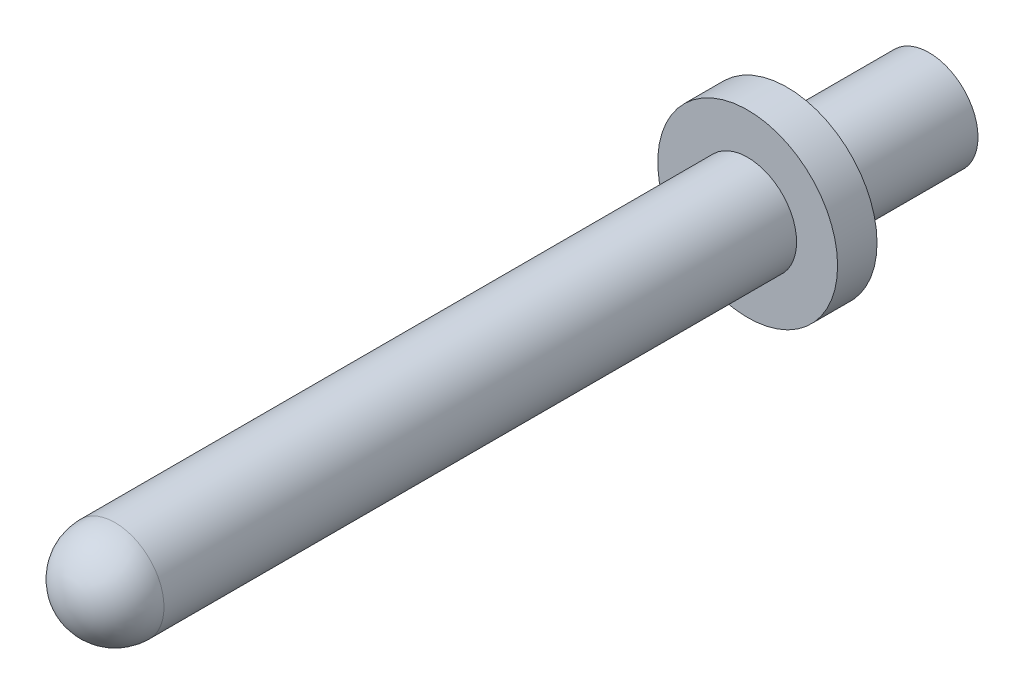
ISO-10303-21;
HEADER;
FILE_DESCRIPTION(('STEP AP214'),'2;1');
FILE_NAME('part.step','',(''),(''),'','','');
FILE_SCHEMA(('AUTOMOTIVE_DESIGN { 1 0 10303 214 1 1 1 1 }'));
ENDSEC;
DATA;
#1=APPLICATION_CONTEXT('core data for automotive mechanical design processes');
#2=APPLICATION_PROTOCOL_DEFINITION('international standard','automotive_design',2000,#1);
#3=PRODUCT_CONTEXT('',#1,'mechanical');
#4=PRODUCT('Part','Part','',(#3));
#5=PRODUCT_RELATED_PRODUCT_CATEGORY('part','',(#4));
#6=PRODUCT_DEFINITION_FORMATION('','',#4);
#7=PRODUCT_DEFINITION_CONTEXT('part definition',#1,'design');
#8=PRODUCT_DEFINITION('design','',#6,#7);
#9=PRODUCT_DEFINITION_SHAPE('','',#8);
#10=(LENGTH_UNIT() NAMED_UNIT(*) SI_UNIT(.MILLI.,.METRE.));
#11=(NAMED_UNIT(*) PLANE_ANGLE_UNIT() SI_UNIT($,.RADIAN.));
#12=(NAMED_UNIT(*) SI_UNIT($,.STERADIAN.) SOLID_ANGLE_UNIT());
#13=UNCERTAINTY_MEASURE_WITH_UNIT(LENGTH_MEASURE(1.E-05),#10,'distance_accuracy_value','');
#14=(GEOMETRIC_REPRESENTATION_CONTEXT(3) GLOBAL_UNCERTAINTY_ASSIGNED_CONTEXT((#13)) GLOBAL_UNIT_ASSIGNED_CONTEXT((#10,
#11,#12)) REPRESENTATION_CONTEXT('',''));
#15=CARTESIAN_POINT('',(0.,0.,0.));
#16=DIRECTION('',(0.,0.,1.));
#17=DIRECTION('',(1.,0.,0.));
#18=AXIS2_PLACEMENT_3D('',#15,#16,#17);
#19=CARTESIAN_POINT('',(0.,0.,-0.787400000000001));
#20=DIRECTION('',(0.,0.,1.));
#21=DIRECTION('',(-1.,0.,0.));
#22=AXIS2_PLACEMENT_3D('',#19,#20,#21);
#23=SPHERICAL_SURFACE('',#22,0.787400000000001);
#24=CARTESIAN_POINT('',(0.,0.,-0.787400000000001));
#25=DIRECTION('',(0.,0.,1.));
#26=DIRECTION('',(1.,0.,0.));
#27=AXIS2_PLACEMENT_3D('',#24,#25,#26);
#28=CIRCLE('',#27,0.787400000000001);
#29=CARTESIAN_POINT('',(0.787400000000001,0.,-0.787400000000001));
#30=VERTEX_POINT('',#29);
#31=EDGE_CURVE('E11',#30,#30,#28,.T.);
#32=ORIENTED_EDGE('',*,*,#31,.T.);
#33=EDGE_LOOP('',(#32));
#34=FACE_BOUND('',#33,.T.);
#35=ADVANCED_FACE('F34',(#34),#23,.T.);
#36=CARTESIAN_POINT('',(0.,0.,0.));
#37=DIRECTION('',(0.,0.,1.));
#38=DIRECTION('',(1.,0.,0.));
#39=AXIS2_PLACEMENT_3D('',#36,#37,#38);
#40=CYLINDRICAL_SURFACE('',#39,0.7874);
#41=CARTESIAN_POINT('',(0.,0.,-10.9728));
#42=DIRECTION('',(0.,0.,1.));
#43=DIRECTION('',(1.,0.,0.));
#44=AXIS2_PLACEMENT_3D('',#41,#42,#43);
#45=CIRCLE('',#44,0.7874);
#46=CARTESIAN_POINT('',(0.7874,0.,-10.9728));
#47=VERTEX_POINT('',#46);
#48=EDGE_CURVE('E40',#47,#47,#45,.T.);
#49=ORIENTED_EDGE('',*,*,#48,.T.);
#50=EDGE_LOOP('',(#49));
#51=FACE_BOUND('',#50,.T.);
#52=ORIENTED_EDGE('',*,*,#31,.F.);
#53=EDGE_LOOP('',(#52));
#54=FACE_BOUND('',#53,.T.);
#55=ADVANCED_FACE('F71',(#51,#54),#40,.T.);
#56=CARTESIAN_POINT('',(0.,0.,-10.9728));
#57=DIRECTION('',(0.,0.,1.));
#58=DIRECTION('',(1.,0.,0.));
#59=AXIS2_PLACEMENT_3D('',#56,#57,#58);
#60=PLANE('',#59);
#61=CARTESIAN_POINT('',(0.,0.,-10.9728));
#62=DIRECTION('',(0.,0.,1.));
#63=DIRECTION('',(1.,0.,0.));
#64=AXIS2_PLACEMENT_3D('',#61,#62,#63);
#65=CIRCLE('',#64,1.4478);
#66=CARTESIAN_POINT('',(1.4478,0.,-10.9728));
#67=VERTEX_POINT('',#66);
#68=EDGE_CURVE('E66',#67,#67,#65,.T.);
#69=ORIENTED_EDGE('',*,*,#68,.T.);
#70=EDGE_LOOP('',(#69));
#71=FACE_BOUND('',#70,.T.);
#72=ORIENTED_EDGE('',*,*,#48,.F.);
#73=EDGE_LOOP('',(#72));
#74=FACE_BOUND('',#73,.T.);
#75=ADVANCED_FACE('F74',(#71,#74),#60,.T.);
#76=CARTESIAN_POINT('',(0.,0.,0.));
#77=DIRECTION('',(0.,0.,1.));
#78=DIRECTION('',(1.,0.,0.));
#79=AXIS2_PLACEMENT_3D('',#76,#77,#78);
#80=CYLINDRICAL_SURFACE('',#79,1.4478);
#81=CARTESIAN_POINT('',(0.,0.,-11.6078));
#82=DIRECTION('',(0.,0.,1.));
#83=DIRECTION('',(1.,0.,0.));
#84=AXIS2_PLACEMENT_3D('',#81,#82,#83);
#85=CIRCLE('',#84,1.4478);
#86=CARTESIAN_POINT('',(1.4478,0.,-11.6078));
#87=VERTEX_POINT('',#86);
#88=EDGE_CURVE('E63',#87,#87,#85,.T.);
#89=ORIENTED_EDGE('',*,*,#88,.T.);
#90=EDGE_LOOP('',(#89));
#91=FACE_BOUND('',#90,.T.);
#92=ORIENTED_EDGE('',*,*,#68,.F.);
#93=EDGE_LOOP('',(#92));
#94=FACE_BOUND('',#93,.T.);
#95=ADVANCED_FACE('F76',(#91,#94),#80,.T.);
#96=CARTESIAN_POINT('',(0.,0.,-11.6078));
#97=DIRECTION('',(0.,0.,1.));
#98=DIRECTION('',(1.,0.,0.));
#99=AXIS2_PLACEMENT_3D('',#96,#97,#98);
#100=PLANE('',#99);
#101=ORIENTED_EDGE('',*,*,#88,.F.);
#102=EDGE_LOOP('',(#101));
#103=FACE_BOUND('',#102,.T.);
#104=CARTESIAN_POINT('',(0.,0.,-11.6078));
#105=DIRECTION('',(0.,0.,1.));
#106=DIRECTION('',(1.,0.,0.));
#107=AXIS2_PLACEMENT_3D('',#104,#105,#106);
#108=CIRCLE('',#107,0.7874);
#109=CARTESIAN_POINT('',(0.7874,0.,-11.6078));
#110=VERTEX_POINT('',#109);
#111=EDGE_CURVE('E60',#110,#110,#108,.T.);
#112=ORIENTED_EDGE('',*,*,#111,.T.);
#113=EDGE_LOOP('',(#112));
#114=FACE_BOUND('',#113,.T.);
#115=ADVANCED_FACE('F83',(#103,#114),#100,.F.);
#116=CARTESIAN_POINT('',(0.,0.,0.));
#117=DIRECTION('',(0.,0.,1.));
#118=DIRECTION('',(1.,0.,0.));
#119=AXIS2_PLACEMENT_3D('',#116,#117,#118);
#120=CYLINDRICAL_SURFACE('',#119,0.7874);
#121=CARTESIAN_POINT('',(0.,0.,-13.8938));
#122=DIRECTION('',(0.,0.,1.));
#123=DIRECTION('',(1.,0.,0.));
#124=AXIS2_PLACEMENT_3D('',#121,#122,#123);
#125=CIRCLE('',#124,0.7874);
#126=CARTESIAN_POINT('',(0.7874,0.,-13.8938));
#127=VERTEX_POINT('',#126);
#128=EDGE_CURVE('E55',#127,#127,#125,.T.);
#129=ORIENTED_EDGE('',*,*,#128,.T.);
#130=EDGE_LOOP('',(#129));
#131=FACE_BOUND('',#130,.T.);
#132=ORIENTED_EDGE('',*,*,#111,.F.);
#133=EDGE_LOOP('',(#132));
#134=FACE_BOUND('',#133,.T.);
#135=ADVANCED_FACE('F116',(#131,#134),#120,.T.);
#136=CARTESIAN_POINT('',(0.,0.,-13.8938));
#137=DIRECTION('',(0.,0.,1.));
#138=DIRECTION('',(1.,0.,0.));
#139=AXIS2_PLACEMENT_3D('',#136,#137,#138);
#140=PLANE('',#139);
#141=ORIENTED_EDGE('',*,*,#128,.F.);
#142=EDGE_LOOP('',(#141));
#143=FACE_BOUND('',#142,.T.);
#144=CARTESIAN_POINT('',(0.,0.,-13.8938));
#145=DIRECTION('',(0.,0.,1.));
#146=DIRECTION('',(1.,0.,0.));
#147=AXIS2_PLACEMENT_3D('',#144,#145,#146);
#148=CIRCLE('',#147,0.5461);
#149=CARTESIAN_POINT('',(0.5461,0.,-13.8938));
#150=VERTEX_POINT('',#149);
#151=EDGE_CURVE('E52',#150,#150,#148,.T.);
#152=ORIENTED_EDGE('',*,*,#151,.T.);
#153=EDGE_LOOP('',(#152));
#154=FACE_BOUND('',#153,.T.);
#155=ADVANCED_FACE('F126',(#143,#154),#140,.F.);
#156=CARTESIAN_POINT('',(0.,0.,0.));
#157=DIRECTION('',(0.,0.,1.));
#158=DIRECTION('',(1.,0.,0.));
#159=AXIS2_PLACEMENT_3D('',#156,#157,#158);
#160=CYLINDRICAL_SURFACE('',#159,0.5461);
#161=ORIENTED_EDGE('',*,*,#151,.F.);
#162=EDGE_LOOP('',(#161));
#163=FACE_BOUND('',#162,.T.);
#164=CARTESIAN_POINT('',(0.,0.,-11.6078));
#165=DIRECTION('',(0.,0.,1.));
#166=DIRECTION('',(1.,0.,0.));
#167=AXIS2_PLACEMENT_3D('',#164,#165,#166);
#168=CIRCLE('',#167,0.5461);
#169=CARTESIAN_POINT('',(0.5461,0.,-11.6078));
#170=VERTEX_POINT('',#169);
#171=EDGE_CURVE('E50',#170,#170,#168,.T.);
#172=ORIENTED_EDGE('',*,*,#171,.T.);
#173=EDGE_LOOP('',(#172));
#174=FACE_BOUND('',#173,.T.);
#175=ADVANCED_FACE('F46',(#163,#174),#160,.F.);
#176=CARTESIAN_POINT('',(0.,0.,-11.6078));
#177=DIRECTION('',(0.,0.,-1.));
#178=DIRECTION('',(-1.,0.,0.));
#179=AXIS2_PLACEMENT_3D('',#176,#177,#178);
#180=CONICAL_SURFACE('',#179,0.5461,1.04416905536115);
#181=CARTESIAN_POINT('',(0.,0.,-11.2903));
#182=VERTEX_POINT('',#181);
#183=VERTEX_LOOP('',#182);
#184=FACE_BOUND('',#183,.T.);
#185=ORIENTED_EDGE('',*,*,#171,.F.);
#186=EDGE_LOOP('',(#185));
#187=FACE_BOUND('',#186,.T.);
#188=ADVANCED_FACE('F43',(#184,#187),#180,.F.);
#189=CLOSED_SHELL('',(#35,#55,#75,#95,#115,#135,#155,#175,#188));
#190=MANIFOLD_SOLID_BREP('B2',#189);
#191=ADVANCED_BREP_SHAPE_REPRESENTATION('',(#18,#190),#14);
#192=SHAPE_DEFINITION_REPRESENTATION(#9,#191);
ENDSEC;
END-ISO-10303-21;
